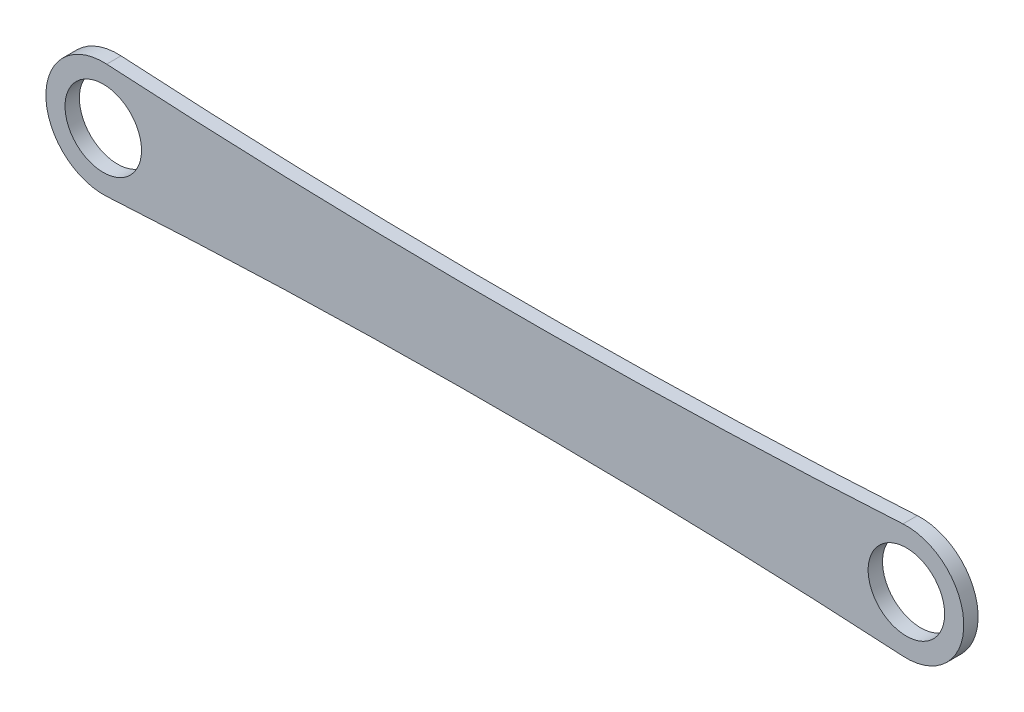
ISO-10303-21;
HEADER;
FILE_DESCRIPTION(('STEP AP214'),'2;1');
FILE_NAME('part.step','',(''),(''),'','','');
FILE_SCHEMA(('AUTOMOTIVE_DESIGN { 1 0 10303 214 1 1 1 1 }'));
ENDSEC;
DATA;
#1=APPLICATION_CONTEXT('core data for automotive mechanical design processes');
#2=APPLICATION_PROTOCOL_DEFINITION('international standard','automotive_design',2000,#1);
#3=PRODUCT_CONTEXT('',#1,'mechanical');
#4=PRODUCT('Part','Part','',(#3));
#5=PRODUCT_RELATED_PRODUCT_CATEGORY('part','',(#4));
#6=PRODUCT_DEFINITION_FORMATION('','',#4);
#7=PRODUCT_DEFINITION_CONTEXT('part definition',#1,'design');
#8=PRODUCT_DEFINITION('design','',#6,#7);
#9=PRODUCT_DEFINITION_SHAPE('','',#8);
#10=(LENGTH_UNIT() NAMED_UNIT(*) SI_UNIT(.MILLI.,.METRE.));
#11=(NAMED_UNIT(*) PLANE_ANGLE_UNIT() SI_UNIT($,.RADIAN.));
#12=(NAMED_UNIT(*) SI_UNIT($,.STERADIAN.) SOLID_ANGLE_UNIT());
#13=UNCERTAINTY_MEASURE_WITH_UNIT(LENGTH_MEASURE(1.E-05),#10,'distance_accuracy_value','');
#14=(GEOMETRIC_REPRESENTATION_CONTEXT(3) GLOBAL_UNCERTAINTY_ASSIGNED_CONTEXT((#13)) GLOBAL_UNIT_ASSIGNED_CONTEXT((#10,
#11,#12)) REPRESENTATION_CONTEXT('',''));
#15=CARTESIAN_POINT('',(0.,0.,0.));
#16=DIRECTION('',(0.,0.,1.));
#17=DIRECTION('',(1.,0.,0.));
#18=AXIS2_PLACEMENT_3D('',#15,#16,#17);
#19=CARTESIAN_POINT('',(63.,352.3748004611,1.5));
#20=DIRECTION('',(0.,0.,1.));
#21=DIRECTION('',(1.,0.,0.));
#22=AXIS2_PLACEMENT_3D('',#19,#20,#21);
#23=PLANE('',#22);
#24=CARTESIAN_POINT('',(0.,0.,1.5));
#25=DIRECTION('',(0.,0.,1.));
#26=DIRECTION('',(1.,0.,0.));
#27=AXIS2_PLACEMENT_3D('',#24,#25,#26);
#28=CIRCLE('',#27,4.);
#29=CARTESIAN_POINT('',(4.,0.,1.5));
#30=VERTEX_POINT('',#29);
#31=EDGE_CURVE('E112',#30,#30,#28,.T.);
#32=ORIENTED_EDGE('',*,*,#31,.F.);
#33=EDGE_LOOP('',(#32));
#34=FACE_BOUND('',#33,.T.);
#35=CARTESIAN_POINT('',(42.,704.7496009222,1.5));
#36=DIRECTION('',(0.,0.,-1.));
#37=DIRECTION('',(1.,0.,0.));
#38=AXIS2_PLACEMENT_3D('',#35,#36,#37);
#39=CIRCLE('',#38,700.);
#40=CARTESIAN_POINT('',(83.643059490085,5.98937337894209,1.5));
#41=VERTEX_POINT('',#40);
#42=CARTESIAN_POINT('',(0.356940509915007,5.98937337894209,1.5));
#43=VERTEX_POINT('',#42);
#44=EDGE_CURVE('E92',#41,#43,#39,.T.);
#45=ORIENTED_EDGE('',*,*,#44,.T.);
#46=CARTESIAN_POINT('',(0.,0.,1.5));
#47=DIRECTION('',(0.,0.,1.));
#48=DIRECTION('',(1.,0.,0.));
#49=AXIS2_PLACEMENT_3D('',#46,#47,#48);
#50=CIRCLE('',#49,5.99999999999988);
#51=CARTESIAN_POINT('',(0.356940509915005,-5.98937337894209,1.5));
#52=VERTEX_POINT('',#51);
#53=EDGE_CURVE('E87',#43,#52,#50,.T.);
#54=ORIENTED_EDGE('',*,*,#53,.T.);
#55=CARTESIAN_POINT('',(42.,-704.7496009222,1.5));
#56=DIRECTION('',(0.,0.,-1.));
#57=DIRECTION('',(-1.,0.,0.));
#58=AXIS2_PLACEMENT_3D('',#55,#56,#57);
#59=CIRCLE('',#58,700.);
#60=CARTESIAN_POINT('',(83.6430594900851,-5.98937337894212,1.5));
#61=VERTEX_POINT('',#60);
#62=EDGE_CURVE('E90',#52,#61,#59,.T.);
#63=ORIENTED_EDGE('',*,*,#62,.T.);
#64=CARTESIAN_POINT('',(84.,0.,1.5));
#65=DIRECTION('',(0.,0.,1.));
#66=DIRECTION('',(1.,0.,0.));
#67=AXIS2_PLACEMENT_3D('',#64,#65,#66);
#68=CIRCLE('',#67,5.99999999999988);
#69=EDGE_CURVE('E57',#61,#41,#68,.T.);
#70=ORIENTED_EDGE('',*,*,#69,.T.);
#71=EDGE_LOOP('',(#45,#54,#63,#70));
#72=FACE_BOUND('',#71,.T.);
#73=CARTESIAN_POINT('',(84.,0.,1.5));
#74=DIRECTION('',(0.,0.,1.));
#75=DIRECTION('',(1.,0.,0.));
#76=AXIS2_PLACEMENT_3D('',#73,#74,#75);
#77=CIRCLE('',#76,4.00000000000001);
#78=CARTESIAN_POINT('',(88.,0.,1.5));
#79=VERTEX_POINT('',#78);
#80=EDGE_CURVE('E134',#79,#79,#77,.T.);
#81=ORIENTED_EDGE('',*,*,#80,.F.);
#82=EDGE_LOOP('',(#81));
#83=FACE_BOUND('',#82,.T.);
#84=ADVANCED_FACE('F39',(#34,#72,#83),#23,.T.);
#85=CARTESIAN_POINT('',(63.,352.3748004611,0.));
#86=DIRECTION('',(0.,0.,1.));
#87=DIRECTION('',(1.,0.,0.));
#88=AXIS2_PLACEMENT_3D('',#85,#86,#87);
#89=PLANE('',#88);
#90=CARTESIAN_POINT('',(42.,704.7496009222,0.));
#91=DIRECTION('',(0.,0.,-1.));
#92=DIRECTION('',(1.,0.,0.));
#93=AXIS2_PLACEMENT_3D('',#90,#91,#92);
#94=CIRCLE('',#93,700.);
#95=CARTESIAN_POINT('',(83.643059490085,5.98937337894209,0.));
#96=VERTEX_POINT('',#95);
#97=CARTESIAN_POINT('',(0.356940509915007,5.98937337894209,0.));
#98=VERTEX_POINT('',#97);
#99=EDGE_CURVE('E108',#96,#98,#94,.T.);
#100=ORIENTED_EDGE('',*,*,#99,.F.);
#101=CARTESIAN_POINT('',(84.,0.,0.));
#102=DIRECTION('',(0.,0.,1.));
#103=DIRECTION('',(1.,0.,0.));
#104=AXIS2_PLACEMENT_3D('',#101,#102,#103);
#105=CIRCLE('',#104,5.99999999999988);
#106=CARTESIAN_POINT('',(83.6430594900851,-5.98937337894212,0.));
#107=VERTEX_POINT('',#106);
#108=EDGE_CURVE('E80',#107,#96,#105,.T.);
#109=ORIENTED_EDGE('',*,*,#108,.F.);
#110=CARTESIAN_POINT('',(42.,-704.7496009222,0.));
#111=DIRECTION('',(0.,0.,-1.));
#112=DIRECTION('',(-1.,0.,0.));
#113=AXIS2_PLACEMENT_3D('',#110,#111,#112);
#114=CIRCLE('',#113,700.);
#115=CARTESIAN_POINT('',(0.356940509915005,-5.98937337894209,0.));
#116=VERTEX_POINT('',#115);
#117=EDGE_CURVE('E74',#116,#107,#114,.T.);
#118=ORIENTED_EDGE('',*,*,#117,.F.);
#119=CARTESIAN_POINT('',(0.,0.,0.));
#120=DIRECTION('',(0.,0.,1.));
#121=DIRECTION('',(1.,0.,0.));
#122=AXIS2_PLACEMENT_3D('',#119,#120,#121);
#123=CIRCLE('',#122,5.99999999999988);
#124=EDGE_CURVE('E97',#98,#116,#123,.T.);
#125=ORIENTED_EDGE('',*,*,#124,.F.);
#126=EDGE_LOOP('',(#100,#109,#118,#125));
#127=FACE_BOUND('',#126,.T.);
#128=CARTESIAN_POINT('',(0.,0.,0.));
#129=DIRECTION('',(0.,0.,1.));
#130=DIRECTION('',(1.,0.,0.));
#131=AXIS2_PLACEMENT_3D('',#128,#129,#130);
#132=CIRCLE('',#131,4.);
#133=CARTESIAN_POINT('',(4.,0.,0.));
#134=VERTEX_POINT('',#133);
#135=EDGE_CURVE('E130',#134,#134,#132,.T.);
#136=ORIENTED_EDGE('',*,*,#135,.T.);
#137=EDGE_LOOP('',(#136));
#138=FACE_BOUND('',#137,.T.);
#139=CARTESIAN_POINT('',(84.,0.,0.));
#140=DIRECTION('',(0.,0.,1.));
#141=DIRECTION('',(1.,0.,0.));
#142=AXIS2_PLACEMENT_3D('',#139,#140,#141);
#143=CIRCLE('',#142,4.00000000000001);
#144=CARTESIAN_POINT('',(88.,0.,0.));
#145=VERTEX_POINT('',#144);
#146=EDGE_CURVE('E138',#145,#145,#143,.T.);
#147=ORIENTED_EDGE('',*,*,#146,.T.);
#148=EDGE_LOOP('',(#147));
#149=FACE_BOUND('',#148,.T.);
#150=ADVANCED_FACE('F125',(#127,#138,#149),#89,.F.);
#151=CARTESIAN_POINT('',(42.,704.7496009222,1.5));
#152=DIRECTION('',(0.,0.,-1.));
#153=DIRECTION('',(-1.,0.,0.));
#154=AXIS2_PLACEMENT_3D('',#151,#152,#153);
#155=CYLINDRICAL_SURFACE('',#154,700.);
#156=ORIENTED_EDGE('',*,*,#99,.T.);
#157=DIRECTION('',(0.,0.,-1.));
#158=VECTOR('',#157,1.);
#159=CARTESIAN_POINT('',(0.356940509915007,5.98937337894209,1.5));
#160=LINE('',#159,#158);
#161=EDGE_CURVE('E11',#43,#98,#160,.T.);
#162=ORIENTED_EDGE('',*,*,#161,.F.);
#163=ORIENTED_EDGE('',*,*,#44,.F.);
#164=DIRECTION('',(0.,0.,-1.));
#165=VECTOR('',#164,1.);
#166=CARTESIAN_POINT('',(83.643059490085,5.98937337894209,1.5));
#167=LINE('',#166,#165);
#168=EDGE_CURVE('E104',#41,#96,#167,.T.);
#169=ORIENTED_EDGE('',*,*,#168,.T.);
#170=EDGE_LOOP('',(#156,#162,#163,#169));
#171=FACE_BOUND('',#170,.T.);
#172=ADVANCED_FACE('F41',(#171),#155,.F.);
#173=CARTESIAN_POINT('',(0.,0.,1.5));
#174=DIRECTION('',(0.,0.,-1.));
#175=DIRECTION('',(-1.,0.,0.));
#176=AXIS2_PLACEMENT_3D('',#173,#174,#175);
#177=CYLINDRICAL_SURFACE('',#176,5.99999999999988);
#178=ORIENTED_EDGE('',*,*,#124,.T.);
#179=DIRECTION('',(0.,0.,-1.));
#180=VECTOR('',#179,1.);
#181=CARTESIAN_POINT('',(0.356940509915005,-5.98937337894209,1.5));
#182=LINE('',#181,#180);
#183=EDGE_CURVE('E49',#52,#116,#182,.T.);
#184=ORIENTED_EDGE('',*,*,#183,.F.);
#185=ORIENTED_EDGE('',*,*,#53,.F.);
#186=ORIENTED_EDGE('',*,*,#161,.T.);
#187=EDGE_LOOP('',(#178,#184,#185,#186));
#188=FACE_BOUND('',#187,.T.);
#189=ADVANCED_FACE('F96',(#188),#177,.T.);
#190=CARTESIAN_POINT('',(42.,-704.7496009222,1.5));
#191=DIRECTION('',(0.,0.,-1.));
#192=DIRECTION('',(-1.,0.,0.));
#193=AXIS2_PLACEMENT_3D('',#190,#191,#192);
#194=CYLINDRICAL_SURFACE('',#193,700.);
#195=ORIENTED_EDGE('',*,*,#117,.T.);
#196=DIRECTION('',(0.,0.,-1.));
#197=VECTOR('',#196,1.);
#198=CARTESIAN_POINT('',(83.6430594900851,-5.98937337894212,1.5));
#199=LINE('',#198,#197);
#200=EDGE_CURVE('E99',#61,#107,#199,.T.);
#201=ORIENTED_EDGE('',*,*,#200,.F.);
#202=ORIENTED_EDGE('',*,*,#62,.F.);
#203=ORIENTED_EDGE('',*,*,#183,.T.);
#204=EDGE_LOOP('',(#195,#201,#202,#203));
#205=FACE_BOUND('',#204,.T.);
#206=ADVANCED_FACE('F100',(#205),#194,.F.);
#207=CARTESIAN_POINT('',(84.,0.,1.5));
#208=DIRECTION('',(0.,0.,-1.));
#209=DIRECTION('',(-1.,0.,0.));
#210=AXIS2_PLACEMENT_3D('',#207,#208,#209);
#211=CYLINDRICAL_SURFACE('',#210,5.99999999999988);
#212=ORIENTED_EDGE('',*,*,#108,.T.);
#213=ORIENTED_EDGE('',*,*,#168,.F.);
#214=ORIENTED_EDGE('',*,*,#69,.F.);
#215=ORIENTED_EDGE('',*,*,#200,.T.);
#216=EDGE_LOOP('',(#212,#213,#214,#215));
#217=FACE_BOUND('',#216,.T.);
#218=ADVANCED_FACE('F122',(#217),#211,.T.);
#219=CARTESIAN_POINT('',(0.,0.,1.5));
#220=DIRECTION('',(0.,0.,-1.));
#221=DIRECTION('',(-1.,0.,0.));
#222=AXIS2_PLACEMENT_3D('',#219,#220,#221);
#223=CYLINDRICAL_SURFACE('',#222,4.);
#224=ORIENTED_EDGE('',*,*,#31,.T.);
#225=EDGE_LOOP('',(#224));
#226=FACE_BOUND('',#225,.T.);
#227=ORIENTED_EDGE('',*,*,#135,.F.);
#228=EDGE_LOOP('',(#227));
#229=FACE_BOUND('',#228,.T.);
#230=ADVANCED_FACE('F157',(#226,#229),#223,.F.);
#231=CARTESIAN_POINT('',(84.,0.,1.5));
#232=DIRECTION('',(0.,0.,-1.));
#233=DIRECTION('',(-1.,0.,0.));
#234=AXIS2_PLACEMENT_3D('',#231,#232,#233);
#235=CYLINDRICAL_SURFACE('',#234,4.00000000000001);
#236=ORIENTED_EDGE('',*,*,#80,.T.);
#237=EDGE_LOOP('',(#236));
#238=FACE_BOUND('',#237,.T.);
#239=ORIENTED_EDGE('',*,*,#146,.F.);
#240=EDGE_LOOP('',(#239));
#241=FACE_BOUND('',#240,.T.);
#242=ADVANCED_FACE('F146',(#238,#241),#235,.F.);
#243=CLOSED_SHELL('',(#84,#150,#172,#189,#206,#218,#230,#242));
#244=MANIFOLD_SOLID_BREP('B2',#243);
#245=ADVANCED_BREP_SHAPE_REPRESENTATION('',(#18,#244),#14);
#246=SHAPE_DEFINITION_REPRESENTATION(#9,#245);
ENDSEC;
END-ISO-10303-21;
